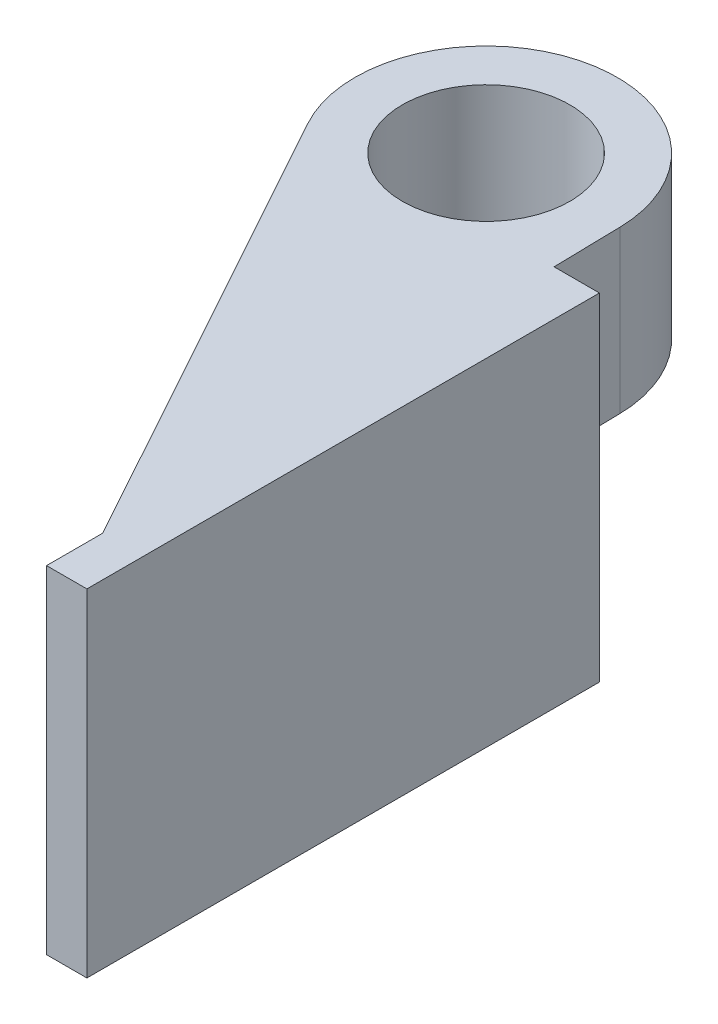
ISO-10303-21;
HEADER;
FILE_DESCRIPTION(('STEP AP214'),'2;1');
FILE_NAME('part.step','',(''),(''),'','','');
FILE_SCHEMA(('AUTOMOTIVE_DESIGN { 1 0 10303 214 1 1 1 1 }'));
ENDSEC;
DATA;
#1=APPLICATION_CONTEXT('core data for automotive mechanical design processes');
#2=APPLICATION_PROTOCOL_DEFINITION('international standard','automotive_design',2000,#1);
#3=PRODUCT_CONTEXT('',#1,'mechanical');
#4=PRODUCT('Part','Part','',(#3));
#5=PRODUCT_RELATED_PRODUCT_CATEGORY('part','',(#4));
#6=PRODUCT_DEFINITION_FORMATION('','',#4);
#7=PRODUCT_DEFINITION_CONTEXT('part definition',#1,'design');
#8=PRODUCT_DEFINITION('design','',#6,#7);
#9=PRODUCT_DEFINITION_SHAPE('','',#8);
#10=(LENGTH_UNIT() NAMED_UNIT(*) SI_UNIT(.MILLI.,.METRE.));
#11=(NAMED_UNIT(*) PLANE_ANGLE_UNIT() SI_UNIT($,.RADIAN.));
#12=(NAMED_UNIT(*) SI_UNIT($,.STERADIAN.) SOLID_ANGLE_UNIT());
#13=UNCERTAINTY_MEASURE_WITH_UNIT(LENGTH_MEASURE(1.E-05),#10,'distance_accuracy_value','');
#14=(GEOMETRIC_REPRESENTATION_CONTEXT(3) GLOBAL_UNCERTAINTY_ASSIGNED_CONTEXT((#13)) GLOBAL_UNIT_ASSIGNED_CONTEXT((#10,
#11,#12)) REPRESENTATION_CONTEXT('',''));
#15=CARTESIAN_POINT('',(0.,0.,0.));
#16=DIRECTION('',(0.,0.,1.));
#17=DIRECTION('',(1.,0.,0.));
#18=AXIS2_PLACEMENT_3D('',#15,#16,#17);
#19=CARTESIAN_POINT('',(0.,4.,0.));
#20=DIRECTION('',(0.,-1.,0.));
#21=DIRECTION('',(0.,0.,-1.));
#22=AXIS2_PLACEMENT_3D('',#19,#20,#21);
#23=CYLINDRICAL_SURFACE('',#22,6.5);
#24=CARTESIAN_POINT('',(0.,-4.,0.));
#25=DIRECTION('',(0.,1.,0.));
#26=DIRECTION('',(0.,0.,1.));
#27=AXIS2_PLACEMENT_3D('',#24,#25,#26);
#28=CIRCLE('',#27,6.5);
#29=CARTESIAN_POINT('',(6.49875364943524,-4.,-0.127283164449008));
#30=VERTEX_POINT('',#29);
#31=CARTESIAN_POINT('',(-5.69172733557227,-4.,3.13914637083067));
#32=VERTEX_POINT('',#31);
#33=EDGE_CURVE('E123',#30,#32,#28,.T.);
#34=ORIENTED_EDGE('',*,*,#33,.T.);
#35=DIRECTION('',(0.,-1.,0.));
#36=VECTOR('',#35,1.);
#37=CARTESIAN_POINT('',(-5.69172733557227,4.,3.13914637083067));
#38=LINE('',#37,#36);
#39=CARTESIAN_POINT('',(-5.69172733557227,4.,3.13914637083067));
#40=VERTEX_POINT('',#39);
#41=EDGE_CURVE('E11',#40,#32,#38,.T.);
#42=ORIENTED_EDGE('',*,*,#41,.F.);
#43=CARTESIAN_POINT('',(0.,4.,0.));
#44=DIRECTION('',(0.,1.,0.));
#45=DIRECTION('',(0.,0.,1.));
#46=AXIS2_PLACEMENT_3D('',#43,#44,#45);
#47=CIRCLE('',#46,6.5);
#48=CARTESIAN_POINT('',(6.49875364943524,4.,-0.127283164449008));
#49=VERTEX_POINT('',#48);
#50=EDGE_CURVE('E158',#49,#40,#47,.T.);
#51=ORIENTED_EDGE('',*,*,#50,.F.);
#52=DIRECTION('',(0.,-1.,0.));
#53=VECTOR('',#52,1.);
#54=CARTESIAN_POINT('',(6.49875364943524,4.,-0.127283164449008));
#55=LINE('',#54,#53);
#56=EDGE_CURVE('E163',#49,#30,#55,.T.);
#57=ORIENTED_EDGE('',*,*,#56,.T.);
#58=EDGE_LOOP('',(#34,#42,#51,#57));
#59=FACE_BOUND('',#58,.T.);
#60=ADVANCED_FACE('F40',(#59),#23,.T.);
#61=CARTESIAN_POINT('',(-5.69172733557227,4.,3.13914637083067));
#62=DIRECTION('',(0.875650359318811,0.,-0.482945595512411));
#63=DIRECTION('',(-0.482945595512411,0.,-0.875650359318811));
#64=AXIS2_PLACEMENT_3D('',#61,#62,#63);
#65=PLANE('',#64);
#66=DIRECTION('',(0.482945595512411,0.,0.875650359318811));
#67=VECTOR('',#66,1.);
#68=CARTESIAN_POINT('',(-5.69172733557227,-4.,3.13914637083067));
#69=LINE('',#68,#67);
#70=CARTESIAN_POINT('',(6.81310243464257,-4.,25.8122151041551));
#71=VERTEX_POINT('',#70);
#72=EDGE_CURVE('E166',#32,#71,#69,.T.);
#73=ORIENTED_EDGE('',*,*,#72,.T.);
#74=DIRECTION('',(0.,-1.,0.));
#75=VECTOR('',#74,1.);
#76=CARTESIAN_POINT('',(6.81310243464257,4.,25.8122151041551));
#77=LINE('',#76,#75);
#78=CARTESIAN_POINT('',(6.81310243464257,4.,25.8122151041551));
#79=VERTEX_POINT('',#78);
#80=EDGE_CURVE('E49',#79,#71,#77,.T.);
#81=ORIENTED_EDGE('',*,*,#80,.F.);
#82=DIRECTION('',(0.482945595512411,0.,0.875650359318811));
#83=VECTOR('',#82,1.);
#84=CARTESIAN_POINT('',(-5.69172733557227,4.,3.13914637083067));
#85=LINE('',#84,#83);
#86=EDGE_CURVE('E87',#40,#79,#85,.T.);
#87=ORIENTED_EDGE('',*,*,#86,.F.);
#88=ORIENTED_EDGE('',*,*,#41,.T.);
#89=EDGE_LOOP('',(#73,#81,#87,#88));
#90=FACE_BOUND('',#89,.T.);
#91=ADVANCED_FACE('F182',(#90),#65,.F.);
#92=CARTESIAN_POINT('',(0.,4.,3.19769704777093));
#93=DIRECTION('',(0.,0.,1.));
#94=DIRECTION('',(1.,0.,0.));
#95=AXIS2_PLACEMENT_3D('',#92,#93,#94);
#96=PLANE('',#95);
#97=DIRECTION('',(-1.,0.,0.));
#98=VECTOR('',#97,1.);
#99=CARTESIAN_POINT('',(0.,-4.,3.19769704777093));
#100=LINE('',#99,#98);
#101=CARTESIAN_POINT('',(6.81310243464257,-4.,3.19769704777092));
#102=VERTEX_POINT('',#101);
#103=CARTESIAN_POINT('',(6.56387598303508,-4.,3.19769704777092));
#104=VERTEX_POINT('',#103);
#105=EDGE_CURVE('E74',#102,#104,#100,.T.);
#106=ORIENTED_EDGE('',*,*,#105,.T.);
#107=DIRECTION('',(0.,-1.,0.));
#108=VECTOR('',#107,1.);
#109=CARTESIAN_POINT('',(6.56387598303508,4.,3.19769704777092));
#110=LINE('',#109,#108);
#111=CARTESIAN_POINT('',(6.56387598303508,4.,3.19769704777092));
#112=VERTEX_POINT('',#111);
#113=EDGE_CURVE('E174',#112,#104,#110,.T.);
#114=ORIENTED_EDGE('',*,*,#113,.F.);
#115=DIRECTION('',(-1.,0.,0.));
#116=VECTOR('',#115,1.);
#117=CARTESIAN_POINT('',(0.,4.,3.19769704777093));
#118=LINE('',#117,#116);
#119=CARTESIAN_POINT('',(8.81309843464257,4.,3.19769704777092));
#120=VERTEX_POINT('',#119);
#121=EDGE_CURVE('E118',#120,#112,#118,.T.);
#122=ORIENTED_EDGE('',*,*,#121,.F.);
#123=DIRECTION('',(0.,-1.,0.));
#124=VECTOR('',#123,1.);
#125=CARTESIAN_POINT('',(8.81309843464257,4.,3.19769704777092));
#126=LINE('',#125,#124);
#127=CARTESIAN_POINT('',(8.81309843464257,-12.7,3.19769704777092));
#128=VERTEX_POINT('',#127);
#129=EDGE_CURVE('E113',#120,#128,#126,.T.);
#130=ORIENTED_EDGE('',*,*,#129,.T.);
#131=DIRECTION('',(1.,0.,0.));
#132=VECTOR('',#131,1.);
#133=CARTESIAN_POINT('',(0.,-12.7,3.19769704777092));
#134=LINE('',#133,#132);
#135=CARTESIAN_POINT('',(6.81310243464257,-12.7,3.19769704777092));
#136=VERTEX_POINT('',#135);
#137=EDGE_CURVE('E116',#136,#128,#134,.T.);
#138=ORIENTED_EDGE('',*,*,#137,.F.);
#139=DIRECTION('',(0.,-1.,0.));
#140=VECTOR('',#139,1.);
#141=CARTESIAN_POINT('',(6.81310243464257,4.,3.19769704777092));
#142=LINE('',#141,#140);
#143=EDGE_CURVE('E124',#102,#136,#142,.T.);
#144=ORIENTED_EDGE('',*,*,#143,.F.);
#145=EDGE_LOOP('',(#106,#114,#122,#130,#138,#144));
#146=FACE_BOUND('',#145,.T.);
#147=ADVANCED_FACE('F115',(#146),#96,.F.);
#148=CARTESIAN_POINT('',(6.49875364943524,4.,-0.127283164449007));
#149=DIRECTION('',(-0.999808253759268,0.,0.0195820252998473));
#150=DIRECTION('',(0.0195820252998473,0.,0.999808253759268));
#151=AXIS2_PLACEMENT_3D('',#148,#149,#150);
#152=PLANE('',#151);
#153=DIRECTION('',(-0.0195820252998473,0.,-0.999808253759268));
#154=VECTOR('',#153,1.);
#155=CARTESIAN_POINT('',(6.49875364943524,-4.,-0.127283164449007));
#156=LINE('',#155,#154);
#157=EDGE_CURVE('E80',#104,#30,#156,.T.);
#158=ORIENTED_EDGE('',*,*,#157,.T.);
#159=ORIENTED_EDGE('',*,*,#56,.F.);
#160=DIRECTION('',(-0.0195820252998473,0.,-0.999808253759268));
#161=VECTOR('',#160,1.);
#162=CARTESIAN_POINT('',(6.49875364943524,4.,-0.127283164449007));
#163=LINE('',#162,#161);
#164=EDGE_CURVE('E57',#112,#49,#163,.T.);
#165=ORIENTED_EDGE('',*,*,#164,.F.);
#166=ORIENTED_EDGE('',*,*,#113,.T.);
#167=EDGE_LOOP('',(#158,#159,#165,#166));
#168=FACE_BOUND('',#167,.T.);
#169=ADVANCED_FACE('F189',(#168),#152,.F.);
#170=CARTESIAN_POINT('',(0.,4.,0.));
#171=DIRECTION('',(0.,1.,0.));
#172=DIRECTION('',(0.,0.,1.));
#173=AXIS2_PLACEMENT_3D('',#170,#171,#172);
#174=PLANE('',#173);
#175=CARTESIAN_POINT('',(0.,4.,0.));
#176=DIRECTION('',(0.,1.,0.));
#177=DIRECTION('',(0.,0.,1.));
#178=AXIS2_PLACEMENT_3D('',#175,#176,#177);
#179=CIRCLE('',#178,4.15);
#180=CARTESIAN_POINT('',(0.,4.,4.15));
#181=VERTEX_POINT('',#180);
#182=EDGE_CURVE('E141',#181,#181,#179,.T.);
#183=ORIENTED_EDGE('',*,*,#182,.F.);
#184=EDGE_LOOP('',(#183));
#185=FACE_BOUND('',#184,.T.);
#186=ORIENTED_EDGE('',*,*,#50,.T.);
#187=ORIENTED_EDGE('',*,*,#86,.T.);
#188=DIRECTION('',(0.,0.,1.));
#189=VECTOR('',#188,1.);
#190=CARTESIAN_POINT('',(6.81310243464257,4.,0.));
#191=LINE('',#190,#189);
#192=CARTESIAN_POINT('',(6.81310243464257,4.,28.5976970477709));
#193=VERTEX_POINT('',#192);
#194=EDGE_CURVE('E150',#79,#193,#191,.T.);
#195=ORIENTED_EDGE('',*,*,#194,.T.);
#196=DIRECTION('',(1.,0.,0.));
#197=VECTOR('',#196,1.);
#198=CARTESIAN_POINT('',(0.,4.,28.5976970477709));
#199=LINE('',#198,#197);
#200=CARTESIAN_POINT('',(8.81309843464257,4.,28.5976970477709));
#201=VERTEX_POINT('',#200);
#202=EDGE_CURVE('E152',#193,#201,#199,.T.);
#203=ORIENTED_EDGE('',*,*,#202,.T.);
#204=DIRECTION('',(0.,0.,1.));
#205=VECTOR('',#204,1.);
#206=CARTESIAN_POINT('',(8.81309843464257,4.,0.));
#207=LINE('',#206,#205);
#208=EDGE_CURVE('E148',#120,#201,#207,.T.);
#209=ORIENTED_EDGE('',*,*,#208,.F.);
#210=ORIENTED_EDGE('',*,*,#121,.T.);
#211=ORIENTED_EDGE('',*,*,#164,.T.);
#212=EDGE_LOOP('',(#186,#187,#195,#203,#209,#210,#211));
#213=FACE_BOUND('',#212,.T.);
#214=ADVANCED_FACE('F191',(#185,#213),#174,.T.);
#215=CARTESIAN_POINT('',(0.,-4.,0.));
#216=DIRECTION('',(0.,1.,0.));
#217=DIRECTION('',(0.,0.,1.));
#218=AXIS2_PLACEMENT_3D('',#215,#216,#217);
#219=PLANE('',#218);
#220=CARTESIAN_POINT('',(0.,-4.,0.));
#221=DIRECTION('',(0.,-1.,0.));
#222=DIRECTION('',(0.,0.,-1.));
#223=AXIS2_PLACEMENT_3D('',#220,#221,#222);
#224=CIRCLE('',#223,1.6);
#225=CARTESIAN_POINT('',(0.,-4.,-1.6));
#226=VERTEX_POINT('',#225);
#227=EDGE_CURVE('E301',#226,#226,#224,.T.);
#228=ORIENTED_EDGE('',*,*,#227,.F.);
#229=EDGE_LOOP('',(#228));
#230=FACE_BOUND('',#229,.T.);
#231=ORIENTED_EDGE('',*,*,#33,.F.);
#232=ORIENTED_EDGE('',*,*,#157,.F.);
#233=ORIENTED_EDGE('',*,*,#105,.F.);
#234=DIRECTION('',(0.,0.,1.));
#235=VECTOR('',#234,1.);
#236=CARTESIAN_POINT('',(6.81310243464257,-4.,0.));
#237=LINE('',#236,#235);
#238=EDGE_CURVE('E169',#102,#71,#237,.T.);
#239=ORIENTED_EDGE('',*,*,#238,.T.);
#240=ORIENTED_EDGE('',*,*,#72,.F.);
#241=EDGE_LOOP('',(#231,#232,#233,#239,#240));
#242=FACE_BOUND('',#241,.T.);
#243=ADVANCED_FACE('F186',(#230,#242),#219,.F.);
#244=CARTESIAN_POINT('',(8.81309843464257,4.,0.));
#245=DIRECTION('',(1.,0.,0.));
#246=DIRECTION('',(0.,0.,-1.));
#247=AXIS2_PLACEMENT_3D('',#244,#245,#246);
#248=PLANE('',#247);
#249=DIRECTION('',(0.,-1.,0.));
#250=VECTOR('',#249,1.);
#251=CARTESIAN_POINT('',(8.81309843464257,4.,28.5976970477709));
#252=LINE('',#251,#250);
#253=CARTESIAN_POINT('',(8.81309843464257,-12.7,28.5976970477709));
#254=VERTEX_POINT('',#253);
#255=EDGE_CURVE('E137',#201,#254,#252,.T.);
#256=ORIENTED_EDGE('',*,*,#255,.T.);
#257=DIRECTION('',(0.,0.,1.));
#258=VECTOR('',#257,1.);
#259=CARTESIAN_POINT('',(8.81309843464257,-12.7,0.));
#260=LINE('',#259,#258);
#261=EDGE_CURVE('E130',#128,#254,#260,.T.);
#262=ORIENTED_EDGE('',*,*,#261,.F.);
#263=ORIENTED_EDGE('',*,*,#129,.F.);
#264=ORIENTED_EDGE('',*,*,#208,.T.);
#265=EDGE_LOOP('',(#256,#262,#263,#264));
#266=FACE_BOUND('',#265,.T.);
#267=ADVANCED_FACE('F135',(#266),#248,.T.);
#268=CARTESIAN_POINT('',(6.81310243464257,4.,0.));
#269=DIRECTION('',(1.,0.,0.));
#270=DIRECTION('',(0.,0.,-1.));
#271=AXIS2_PLACEMENT_3D('',#268,#269,#270);
#272=PLANE('',#271);
#273=ORIENTED_EDGE('',*,*,#238,.F.);
#274=ORIENTED_EDGE('',*,*,#143,.T.);
#275=DIRECTION('',(0.,0.,1.));
#276=VECTOR('',#275,1.);
#277=CARTESIAN_POINT('',(6.81310243464257,-12.7,0.));
#278=LINE('',#277,#276);
#279=CARTESIAN_POINT('',(6.81310243464257,-12.7,28.5976970477709));
#280=VERTEX_POINT('',#279);
#281=EDGE_CURVE('E133',#136,#280,#278,.T.);
#282=ORIENTED_EDGE('',*,*,#281,.T.);
#283=DIRECTION('',(0.,-1.,0.));
#284=VECTOR('',#283,1.);
#285=CARTESIAN_POINT('',(6.81310243464257,4.,28.5976970477709));
#286=LINE('',#285,#284);
#287=EDGE_CURVE('E155',#193,#280,#286,.T.);
#288=ORIENTED_EDGE('',*,*,#287,.F.);
#289=ORIENTED_EDGE('',*,*,#194,.F.);
#290=ORIENTED_EDGE('',*,*,#80,.T.);
#291=EDGE_LOOP('',(#273,#274,#282,#288,#289,#290));
#292=FACE_BOUND('',#291,.T.);
#293=ADVANCED_FACE('F180',(#292),#272,.F.);
#294=CARTESIAN_POINT('',(0.,4.,28.5976970477709));
#295=DIRECTION('',(0.,0.,-1.));
#296=DIRECTION('',(-1.,0.,0.));
#297=AXIS2_PLACEMENT_3D('',#294,#295,#296);
#298=PLANE('',#297);
#299=ORIENTED_EDGE('',*,*,#287,.T.);
#300=DIRECTION('',(1.,0.,0.));
#301=VECTOR('',#300,1.);
#302=CARTESIAN_POINT('',(0.,-12.7,28.5976970477709));
#303=LINE('',#302,#301);
#304=EDGE_CURVE('E146',#280,#254,#303,.T.);
#305=ORIENTED_EDGE('',*,*,#304,.T.);
#306=ORIENTED_EDGE('',*,*,#255,.F.);
#307=ORIENTED_EDGE('',*,*,#202,.F.);
#308=EDGE_LOOP('',(#299,#305,#306,#307));
#309=FACE_BOUND('',#308,.T.);
#310=ADVANCED_FACE('F232',(#309),#298,.F.);
#311=CARTESIAN_POINT('',(0.,-12.7,0.));
#312=DIRECTION('',(0.,1.,0.));
#313=DIRECTION('',(0.,0.,1.));
#314=AXIS2_PLACEMENT_3D('',#311,#312,#313);
#315=PLANE('',#314);
#316=ORIENTED_EDGE('',*,*,#261,.T.);
#317=ORIENTED_EDGE('',*,*,#304,.F.);
#318=ORIENTED_EDGE('',*,*,#281,.F.);
#319=ORIENTED_EDGE('',*,*,#137,.T.);
#320=EDGE_LOOP('',(#316,#317,#318,#319));
#321=FACE_BOUND('',#320,.T.);
#322=ADVANCED_FACE('F128',(#321),#315,.F.);
#323=CARTESIAN_POINT('',(0.,-1.95,0.));
#324=DIRECTION('',(0.,1.,0.));
#325=DIRECTION('',(0.,0.,1.));
#326=AXIS2_PLACEMENT_3D('',#323,#324,#325);
#327=CYLINDRICAL_SURFACE('',#326,4.15);
#328=CARTESIAN_POINT('',(0.,-1.95,0.));
#329=DIRECTION('',(0.,1.,0.));
#330=DIRECTION('',(0.,0.,1.));
#331=AXIS2_PLACEMENT_3D('',#328,#329,#330);
#332=CIRCLE('',#331,4.15);
#333=CARTESIAN_POINT('',(0.,-1.95,4.15));
#334=VERTEX_POINT('',#333);
#335=EDGE_CURVE('E138',#334,#334,#332,.T.);
#336=ORIENTED_EDGE('',*,*,#335,.F.);
#337=EDGE_LOOP('',(#336));
#338=FACE_BOUND('',#337,.T.);
#339=ORIENTED_EDGE('',*,*,#182,.T.);
#340=EDGE_LOOP('',(#339));
#341=FACE_BOUND('',#340,.T.);
#342=ADVANCED_FACE('F250',(#338,#341),#327,.F.);
#343=CARTESIAN_POINT('',(0.,-1.95,0.));
#344=DIRECTION('',(0.,1.,0.));
#345=DIRECTION('',(0.,0.,1.));
#346=AXIS2_PLACEMENT_3D('',#343,#344,#345);
#347=PLANE('',#346);
#348=CARTESIAN_POINT('',(0.,-1.95,0.));
#349=DIRECTION('',(0.,1.,0.));
#350=DIRECTION('',(0.,0.,1.));
#351=AXIS2_PLACEMENT_3D('',#348,#349,#350);
#352=CIRCLE('',#351,1.6);
#353=CARTESIAN_POINT('',(0.,-1.95,1.6));
#354=VERTEX_POINT('',#353);
#355=EDGE_CURVE('E43',#354,#354,#352,.T.);
#356=ORIENTED_EDGE('',*,*,#355,.F.);
#357=EDGE_LOOP('',(#356));
#358=FACE_BOUND('',#357,.T.);
#359=ORIENTED_EDGE('',*,*,#335,.T.);
#360=EDGE_LOOP('',(#359));
#361=FACE_BOUND('',#360,.T.);
#362=ADVANCED_FACE('F265',(#358,#361),#347,.T.);
#363=CARTESIAN_POINT('',(0.,4.,0.));
#364=DIRECTION('',(0.,-1.,0.));
#365=DIRECTION('',(0.,0.,-1.));
#366=AXIS2_PLACEMENT_3D('',#363,#364,#365);
#367=CYLINDRICAL_SURFACE('',#366,1.6);
#368=ORIENTED_EDGE('',*,*,#355,.T.);
#369=EDGE_LOOP('',(#368));
#370=FACE_BOUND('',#369,.T.);
#371=ORIENTED_EDGE('',*,*,#227,.T.);
#372=EDGE_LOOP('',(#371));
#373=FACE_BOUND('',#372,.T.);
#374=ADVANCED_FACE('F282',(#370,#373),#367,.F.);
#375=CLOSED_SHELL('',(#60,#91,#147,#169,#214,#243,#267,#293,#310,#322,#342,#362,#374));
#376=MANIFOLD_SOLID_BREP('B2',#375);
#377=ADVANCED_BREP_SHAPE_REPRESENTATION('',(#18,#376),#14);
#378=SHAPE_DEFINITION_REPRESENTATION(#9,#377);
ENDSEC;
END-ISO-10303-21;
